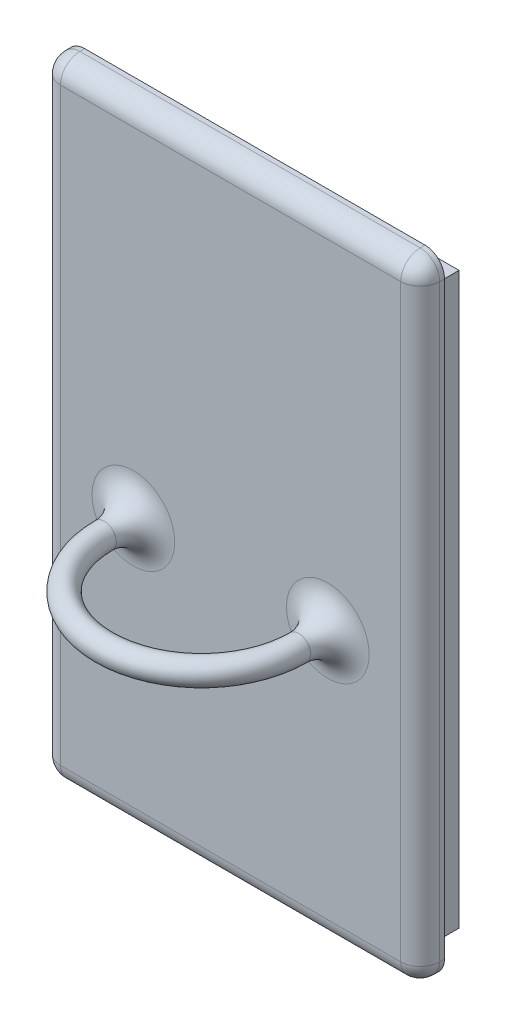
ISO-10303-21;
HEADER;
FILE_DESCRIPTION(('STEP AP214'),'2;1');
FILE_NAME('part.step','',(''),(''),'','','');
FILE_SCHEMA(('AUTOMOTIVE_DESIGN { 1 0 10303 214 1 1 1 1 }'));
ENDSEC;
DATA;
#1=APPLICATION_CONTEXT('core data for automotive mechanical design processes');
#2=APPLICATION_PROTOCOL_DEFINITION('international standard','automotive_design',2000,#1);
#3=PRODUCT_CONTEXT('',#1,'mechanical');
#4=PRODUCT('Part','Part','',(#3));
#5=PRODUCT_RELATED_PRODUCT_CATEGORY('part','',(#4));
#6=PRODUCT_DEFINITION_FORMATION('','',#4);
#7=PRODUCT_DEFINITION_CONTEXT('part definition',#1,'design');
#8=PRODUCT_DEFINITION('design','',#6,#7);
#9=PRODUCT_DEFINITION_SHAPE('','',#8);
#10=(LENGTH_UNIT() NAMED_UNIT(*) SI_UNIT(.MILLI.,.METRE.));
#11=(NAMED_UNIT(*) PLANE_ANGLE_UNIT() SI_UNIT($,.RADIAN.));
#12=(NAMED_UNIT(*) SI_UNIT($,.STERADIAN.) SOLID_ANGLE_UNIT());
#13=UNCERTAINTY_MEASURE_WITH_UNIT(LENGTH_MEASURE(1.E-05),#10,'distance_accuracy_value','');
#14=(GEOMETRIC_REPRESENTATION_CONTEXT(3) GLOBAL_UNCERTAINTY_ASSIGNED_CONTEXT((#13)) GLOBAL_UNIT_ASSIGNED_CONTEXT((#10,
#11,#12)) REPRESENTATION_CONTEXT('',''));
#15=CARTESIAN_POINT('',(0.,0.,0.));
#16=DIRECTION('',(0.,0.,1.));
#17=DIRECTION('',(1.,0.,0.));
#18=AXIS2_PLACEMENT_3D('',#15,#16,#17);
#19=CARTESIAN_POINT('',(0.,0.,0.));
#20=DIRECTION('',(0.,0.,-1.));
#21=DIRECTION('',(-1.,0.,0.));
#22=AXIS2_PLACEMENT_3D('',#19,#20,#21);
#23=PLANE('',#22);
#24=DIRECTION('',(-1.,0.,0.));
#25=VECTOR('',#24,1.);
#26=CARTESIAN_POINT('',(-24.765,41.021,0.));
#27=LINE('',#26,#25);
#28=CARTESIAN_POINT('',(22.225,41.021,0.));
#29=VERTEX_POINT('',#28);
#30=CARTESIAN_POINT('',(-22.225,41.021,0.));
#31=VERTEX_POINT('',#30);
#32=EDGE_CURVE('E250',#29,#31,#27,.T.);
#33=ORIENTED_EDGE('',*,*,#32,.F.);
#34=CARTESIAN_POINT('',(22.225,38.481,0.));
#35=DIRECTION('',(0.,0.,-1.));
#36=DIRECTION('',(-1.,0.,0.));
#37=AXIS2_PLACEMENT_3D('',#34,#35,#36);
#38=CIRCLE('',#37,2.54);
#39=CARTESIAN_POINT('',(24.765,38.481,0.));
#40=VERTEX_POINT('',#39);
#41=EDGE_CURVE('E315',#29,#40,#38,.T.);
#42=ORIENTED_EDGE('',*,*,#41,.T.);
#43=DIRECTION('',(0.,1.,0.));
#44=VECTOR('',#43,1.);
#45=CARTESIAN_POINT('',(24.765,-18.570359608,0.));
#46=LINE('',#45,#44);
#47=CARTESIAN_POINT('',(24.765,-38.481,0.));
#48=VERTEX_POINT('',#47);
#49=EDGE_CURVE('E266',#48,#40,#46,.T.);
#50=ORIENTED_EDGE('',*,*,#49,.F.);
#51=CARTESIAN_POINT('',(22.225,-38.481,0.));
#52=DIRECTION('',(0.,0.,-1.));
#53=DIRECTION('',(-1.,0.,0.));
#54=AXIS2_PLACEMENT_3D('',#51,#52,#53);
#55=CIRCLE('',#54,2.54);
#56=CARTESIAN_POINT('',(22.225,-41.021,0.));
#57=VERTEX_POINT('',#56);
#58=EDGE_CURVE('E309',#48,#57,#55,.T.);
#59=ORIENTED_EDGE('',*,*,#58,.T.);
#60=DIRECTION('',(1.,0.,0.));
#61=VECTOR('',#60,1.);
#62=CARTESIAN_POINT('',(-24.765,-41.021,0.));
#63=LINE('',#62,#61);
#64=CARTESIAN_POINT('',(-22.225,-41.021,0.));
#65=VERTEX_POINT('',#64);
#66=EDGE_CURVE('E253',#65,#57,#63,.T.);
#67=ORIENTED_EDGE('',*,*,#66,.F.);
#68=CARTESIAN_POINT('',(-22.225,-38.481,0.));
#69=DIRECTION('',(0.,0.,-1.));
#70=DIRECTION('',(-1.,0.,0.));
#71=AXIS2_PLACEMENT_3D('',#68,#69,#70);
#72=CIRCLE('',#71,2.54);
#73=CARTESIAN_POINT('',(-24.765,-38.481,0.));
#74=VERTEX_POINT('',#73);
#75=EDGE_CURVE('E311',#65,#74,#72,.T.);
#76=ORIENTED_EDGE('',*,*,#75,.T.);
#77=DIRECTION('',(0.,-1.,0.));
#78=VECTOR('',#77,1.);
#79=CARTESIAN_POINT('',(-24.765,-37.211,0.));
#80=LINE('',#79,#78);
#81=CARTESIAN_POINT('',(-24.765,38.481,0.));
#82=VERTEX_POINT('',#81);
#83=EDGE_CURVE('E263',#82,#74,#80,.T.);
#84=ORIENTED_EDGE('',*,*,#83,.F.);
#85=CARTESIAN_POINT('',(-22.225,38.481,0.));
#86=DIRECTION('',(0.,0.,-1.));
#87=DIRECTION('',(-1.,0.,0.));
#88=AXIS2_PLACEMENT_3D('',#85,#86,#87);
#89=CIRCLE('',#88,2.54);
#90=EDGE_CURVE('E313',#82,#31,#89,.T.);
#91=ORIENTED_EDGE('',*,*,#90,.T.);
#92=EDGE_LOOP('',(#33,#42,#50,#59,#67,#76,#84,#91));
#93=FACE_BOUND('',#92,.T.);
#94=DIRECTION('',(1.,0.,0.));
#95=VECTOR('',#94,1.);
#96=CARTESIAN_POINT('',(23.495,37.211,0.));
#97=LINE('',#96,#95);
#98=CARTESIAN_POINT('',(-23.495,37.211,0.));
#99=VERTEX_POINT('',#98);
#100=CARTESIAN_POINT('',(23.495,37.211,0.));
#101=VERTEX_POINT('',#100);
#102=EDGE_CURVE('E237',#99,#101,#97,.T.);
#103=ORIENTED_EDGE('',*,*,#102,.F.);
#104=DIRECTION('',(0.,1.,0.));
#105=VECTOR('',#104,1.);
#106=CARTESIAN_POINT('',(-23.495,-37.211,0.));
#107=LINE('',#106,#105);
#108=CARTESIAN_POINT('',(-23.495,-37.211,0.));
#109=VERTEX_POINT('',#108);
#110=EDGE_CURVE('E202',#109,#99,#107,.T.);
#111=ORIENTED_EDGE('',*,*,#110,.F.);
#112=DIRECTION('',(-1.,0.,0.));
#113=VECTOR('',#112,1.);
#114=CARTESIAN_POINT('',(23.495,-37.211,0.));
#115=LINE('',#114,#113);
#116=CARTESIAN_POINT('',(23.495,-37.211,0.));
#117=VERTEX_POINT('',#116);
#118=EDGE_CURVE('E228',#117,#109,#115,.T.);
#119=ORIENTED_EDGE('',*,*,#118,.F.);
#120=DIRECTION('',(0.,-1.,0.));
#121=VECTOR('',#120,1.);
#122=CARTESIAN_POINT('',(23.495,-37.211,0.));
#123=LINE('',#122,#121);
#124=EDGE_CURVE('E239',#101,#117,#123,.T.);
#125=ORIENTED_EDGE('',*,*,#124,.F.);
#126=EDGE_LOOP('',(#103,#111,#119,#125));
#127=FACE_BOUND('',#126,.T.);
#128=ADVANCED_FACE('F57',(#93,#127),#23,.T.);
#129=CARTESIAN_POINT('',(0.,0.,3.175));
#130=DIRECTION('',(0.,0.,-1.));
#131=DIRECTION('',(-1.,0.,0.));
#132=AXIS2_PLACEMENT_3D('',#129,#130,#131);
#133=PLANE('',#132);
#134=DIRECTION('',(0.,1.,0.));
#135=VECTOR('',#134,1.);
#136=CARTESIAN_POINT('',(22.225,0.,3.175));
#137=LINE('',#136,#135);
#138=CARTESIAN_POINT('',(22.225,-38.481,3.175));
#139=VERTEX_POINT('',#138);
#140=CARTESIAN_POINT('',(22.225,38.481,3.175));
#141=VERTEX_POINT('',#140);
#142=EDGE_CURVE('E281',#139,#141,#137,.T.);
#143=ORIENTED_EDGE('',*,*,#142,.T.);
#144=DIRECTION('',(-1.,0.,0.));
#145=VECTOR('',#144,1.);
#146=CARTESIAN_POINT('',(-24.765,38.481,3.175));
#147=LINE('',#146,#145);
#148=CARTESIAN_POINT('',(-22.225,38.481,3.175));
#149=VERTEX_POINT('',#148);
#150=EDGE_CURVE('E284',#141,#149,#147,.T.);
#151=ORIENTED_EDGE('',*,*,#150,.T.);
#152=DIRECTION('',(0.,-1.,0.));
#153=VECTOR('',#152,1.);
#154=CARTESIAN_POINT('',(-22.225,0.,3.175));
#155=LINE('',#154,#153);
#156=CARTESIAN_POINT('',(-22.225,-38.481,3.175));
#157=VERTEX_POINT('',#156);
#158=EDGE_CURVE('E278',#149,#157,#155,.T.);
#159=ORIENTED_EDGE('',*,*,#158,.T.);
#160=DIRECTION('',(1.,0.,0.));
#161=VECTOR('',#160,1.);
#162=CARTESIAN_POINT('',(24.765,-38.481,3.175));
#163=LINE('',#162,#161);
#164=EDGE_CURVE('E275',#157,#139,#163,.T.);
#165=ORIENTED_EDGE('',*,*,#164,.T.);
#166=EDGE_LOOP('',(#143,#151,#159,#165));
#167=FACE_BOUND('',#166,.T.);
#168=CARTESIAN_POINT('',(12.7,-5.77067984800001,3.175));
#169=DIRECTION('',(0.,0.,-1.));
#170=DIRECTION('',(-1.,0.,0.));
#171=AXIS2_PLACEMENT_3D('',#168,#169,#170);
#172=CIRCLE('',#171,5.3975);
#173=CARTESIAN_POINT('',(7.30249999999998,-5.77067984800001,3.175));
#174=VERTEX_POINT('',#173);
#175=EDGE_CURVE('E272',#174,#174,#172,.T.);
#176=ORIENTED_EDGE('',*,*,#175,.T.);
#177=EDGE_LOOP('',(#176));
#178=FACE_BOUND('',#177,.T.);
#179=CARTESIAN_POINT('',(-12.7,-5.77067984800001,3.175));
#180=DIRECTION('',(0.,0.,-1.));
#181=DIRECTION('',(-1.,0.,0.));
#182=AXIS2_PLACEMENT_3D('',#179,#180,#181);
#183=CIRCLE('',#182,5.3975);
#184=CARTESIAN_POINT('',(-18.0975,-5.77067984800001,3.175));
#185=VERTEX_POINT('',#184);
#186=EDGE_CURVE('E269',#185,#185,#183,.T.);
#187=ORIENTED_EDGE('',*,*,#186,.T.);
#188=EDGE_LOOP('',(#187));
#189=FACE_BOUND('',#188,.T.);
#190=ADVANCED_FACE('F381',(#167,#178,#189),#133,.F.);
#191=CARTESIAN_POINT('',(-24.765,-37.211,3.175));
#192=DIRECTION('',(1.,0.,0.));
#193=DIRECTION('',(0.,1.,0.));
#194=AXIS2_PLACEMENT_3D('',#191,#192,#193);
#195=PLANE('',#194);
#196=DIRECTION('',(0.,-1.,0.));
#197=VECTOR('',#196,1.);
#198=CARTESIAN_POINT('',(-24.765,-37.211,0.635));
#199=LINE('',#198,#197);
#200=CARTESIAN_POINT('',(-24.765,-38.481,0.635));
#201=VERTEX_POINT('',#200);
#202=CARTESIAN_POINT('',(-24.765,38.481,0.635));
#203=VERTEX_POINT('',#202);
#204=EDGE_CURVE('E290',#201,#203,#199,.F.);
#205=ORIENTED_EDGE('',*,*,#204,.T.);
#206=DIRECTION('',(0.,0.,1.));
#207=VECTOR('',#206,1.);
#208=CARTESIAN_POINT('',(-24.765,38.481,0.));
#209=LINE('',#208,#207);
#210=EDGE_CURVE('E320',#203,#82,#209,.F.);
#211=ORIENTED_EDGE('',*,*,#210,.T.);
#212=ORIENTED_EDGE('',*,*,#83,.T.);
#213=DIRECTION('',(0.,0.,1.));
#214=VECTOR('',#213,1.);
#215=CARTESIAN_POINT('',(-24.765,-38.481,0.634999999999997));
#216=LINE('',#215,#214);
#217=EDGE_CURVE('E317',#74,#201,#216,.T.);
#218=ORIENTED_EDGE('',*,*,#217,.T.);
#219=EDGE_LOOP('',(#205,#211,#212,#218));
#220=FACE_BOUND('',#219,.T.);
#221=ADVANCED_FACE('F393',(#220),#195,.F.);
#222=CARTESIAN_POINT('',(24.765,-18.570359608,3.175));
#223=DIRECTION('',(-1.,0.,0.));
#224=DIRECTION('',(0.,-1.,0.));
#225=AXIS2_PLACEMENT_3D('',#222,#223,#224);
#226=PLANE('',#225);
#227=ORIENTED_EDGE('',*,*,#49,.T.);
#228=DIRECTION('',(0.,0.,1.));
#229=VECTOR('',#228,1.);
#230=CARTESIAN_POINT('',(24.765,38.481,0.634999999999997));
#231=LINE('',#230,#229);
#232=CARTESIAN_POINT('',(24.765,38.481,0.635));
#233=VERTEX_POINT('',#232);
#234=EDGE_CURVE('E301',#40,#233,#231,.T.);
#235=ORIENTED_EDGE('',*,*,#234,.T.);
#236=DIRECTION('',(0.,1.,0.));
#237=VECTOR('',#236,1.);
#238=CARTESIAN_POINT('',(24.765,-18.570359608,0.635));
#239=LINE('',#238,#237);
#240=CARTESIAN_POINT('',(24.765,-38.481,0.635));
#241=VERTEX_POINT('',#240);
#242=EDGE_CURVE('E287',#233,#241,#239,.F.);
#243=ORIENTED_EDGE('',*,*,#242,.T.);
#244=DIRECTION('',(0.,0.,1.));
#245=VECTOR('',#244,1.);
#246=CARTESIAN_POINT('',(24.765,-38.481,0.));
#247=LINE('',#246,#245);
#248=EDGE_CURVE('E299',#241,#48,#247,.F.);
#249=ORIENTED_EDGE('',*,*,#248,.T.);
#250=EDGE_LOOP('',(#227,#235,#243,#249));
#251=FACE_BOUND('',#250,.T.);
#252=ADVANCED_FACE('F363',(#251),#226,.F.);
#253=CARTESIAN_POINT('',(0.,-5.77067984800001,6.985));
#254=DIRECTION('',(0.,-1.,0.));
#255=DIRECTION('',(0.,0.,-1.));
#256=AXIS2_PLACEMENT_3D('',#253,#254,#255);
#257=TOROIDAL_SURFACE('',#256,12.7,1.5875);
#258=CARTESIAN_POINT('',(12.7,-5.77067984800001,6.98499999999998));
#259=DIRECTION('',(0.,0.,1.));
#260=DIRECTION('',(1.,0.,0.));
#261=AXIS2_PLACEMENT_3D('',#258,#259,#260);
#262=CIRCLE('',#261,1.5875);
#263=CARTESIAN_POINT('',(14.2875,-5.77067984800001,6.98499999999997));
#264=VERTEX_POINT('',#263);
#265=EDGE_CURVE('E257',#264,#264,#262,.T.);
#266=CARTESIAN_POINT('',(-12.7,-5.77067984800001,6.985));
#267=DIRECTION('',(0.,0.,-1.));
#268=DIRECTION('',(-1.,0.,0.));
#269=AXIS2_PLACEMENT_3D('',#266,#267,#268);
#270=CIRCLE('',#269,1.5875);
#271=CARTESIAN_POINT('',(-14.2875,-5.77067984800001,6.985));
#272=VERTEX_POINT('',#271);
#273=EDGE_CURVE('E260',#272,#272,#270,.T.);
#274=CARTESIAN_POINT('',(0.,-5.77067984800001,6.985));
#275=DIRECTION('',(0.,-1.,0.));
#276=DIRECTION('',(0.,0.,-1.));
#277=AXIS2_PLACEMENT_3D('',#274,#275,#276);
#278=CIRCLE('',#277,14.2875);
#279=EDGE_CURVE('',#264,#272,#278,.T.);
#280=ORIENTED_EDGE('',*,*,#265,.T.);
#281=ORIENTED_EDGE('',*,*,#273,.F.);
#282=ORIENTED_EDGE('',*,*,#279,.T.);
#283=ORIENTED_EDGE('',*,*,#279,.F.);
#284=EDGE_LOOP('',(#280,#282,#281,#283));
#285=FACE_BOUND('',#284,.T.);
#286=ADVANCED_FACE('F651',(#285),#257,.T.);
#287=CARTESIAN_POINT('',(12.7,-5.77067984800001,6.985));
#288=DIRECTION('',(0.,0.,-1.));
#289=DIRECTION('',(-1.,0.,0.));
#290=AXIS2_PLACEMENT_3D('',#287,#288,#289);
#291=TOROIDAL_SURFACE('',#290,5.3975,3.81);
#292=ORIENTED_EDGE('',*,*,#175,.F.);
#293=EDGE_LOOP('',(#292));
#294=FACE_BOUND('',#293,.T.);
#295=ORIENTED_EDGE('',*,*,#265,.F.);
#296=EDGE_LOOP('',(#295));
#297=FACE_BOUND('',#296,.T.);
#298=ADVANCED_FACE('F424',(#294,#297),#291,.F.);
#299=CARTESIAN_POINT('',(-12.7,-5.77067984800001,6.985));
#300=DIRECTION('',(0.,0.,-1.));
#301=DIRECTION('',(-1.,0.,0.));
#302=AXIS2_PLACEMENT_3D('',#299,#300,#301);
#303=TOROIDAL_SURFACE('',#302,5.3975,3.81);
#304=ORIENTED_EDGE('',*,*,#273,.T.);
#305=EDGE_LOOP('',(#304));
#306=FACE_BOUND('',#305,.T.);
#307=ORIENTED_EDGE('',*,*,#186,.F.);
#308=EDGE_LOOP('',(#307));
#309=FACE_BOUND('',#308,.T.);
#310=ADVANCED_FACE('F415',(#306,#309),#303,.F.);
#311=CARTESIAN_POINT('',(-24.765,-41.021,-49.6763223276442));
#312=DIRECTION('',(0.,-1.,0.));
#313=DIRECTION('',(0.,0.,-1.));
#314=AXIS2_PLACEMENT_3D('',#311,#312,#313);
#315=PLANE('',#314);
#316=DIRECTION('',(1.,0.,0.));
#317=VECTOR('',#316,1.);
#318=CARTESIAN_POINT('',(-24.765,-41.021,0.635));
#319=LINE('',#318,#317);
#320=CARTESIAN_POINT('',(22.225,-41.021,0.635));
#321=VERTEX_POINT('',#320);
#322=CARTESIAN_POINT('',(-22.225,-41.021,0.635));
#323=VERTEX_POINT('',#322);
#324=EDGE_CURVE('E296',#321,#323,#319,.F.);
#325=ORIENTED_EDGE('',*,*,#324,.T.);
#326=DIRECTION('',(0.,0.,1.));
#327=VECTOR('',#326,1.);
#328=CARTESIAN_POINT('',(-22.225,-41.021,0.));
#329=LINE('',#328,#327);
#330=EDGE_CURVE('E324',#323,#65,#329,.F.);
#331=ORIENTED_EDGE('',*,*,#330,.T.);
#332=ORIENTED_EDGE('',*,*,#66,.T.);
#333=DIRECTION('',(0.,0.,1.));
#334=VECTOR('',#333,1.);
#335=CARTESIAN_POINT('',(22.225,-41.021,0.634999999999997));
#336=LINE('',#335,#334);
#337=EDGE_CURVE('E322',#57,#321,#336,.T.);
#338=ORIENTED_EDGE('',*,*,#337,.T.);
#339=EDGE_LOOP('',(#325,#331,#332,#338));
#340=FACE_BOUND('',#339,.T.);
#341=ADVANCED_FACE('F412',(#340),#315,.T.);
#342=CARTESIAN_POINT('',(-24.765,41.021,-49.6763223276442));
#343=DIRECTION('',(0.,1.,0.));
#344=DIRECTION('',(0.,0.,1.));
#345=AXIS2_PLACEMENT_3D('',#342,#343,#344);
#346=PLANE('',#345);
#347=DIRECTION('',(-1.,0.,0.));
#348=VECTOR('',#347,1.);
#349=CARTESIAN_POINT('',(24.765,41.021,0.635));
#350=LINE('',#349,#348);
#351=CARTESIAN_POINT('',(-22.225,41.021,0.635));
#352=VERTEX_POINT('',#351);
#353=CARTESIAN_POINT('',(22.225,41.021,0.635));
#354=VERTEX_POINT('',#353);
#355=EDGE_CURVE('E293',#352,#354,#350,.F.);
#356=ORIENTED_EDGE('',*,*,#355,.T.);
#357=DIRECTION('',(0.,0.,1.));
#358=VECTOR('',#357,1.);
#359=CARTESIAN_POINT('',(22.225,41.021,0.));
#360=LINE('',#359,#358);
#361=EDGE_CURVE('E307',#354,#29,#360,.F.);
#362=ORIENTED_EDGE('',*,*,#361,.T.);
#363=ORIENTED_EDGE('',*,*,#32,.T.);
#364=DIRECTION('',(0.,0.,1.));
#365=VECTOR('',#364,1.);
#366=CARTESIAN_POINT('',(-22.225,41.021,0.634999999999997));
#367=LINE('',#366,#365);
#368=EDGE_CURVE('E304',#31,#352,#367,.T.);
#369=ORIENTED_EDGE('',*,*,#368,.T.);
#370=EDGE_LOOP('',(#356,#362,#363,#369));
#371=FACE_BOUND('',#370,.T.);
#372=ADVANCED_FACE('F414',(#371),#346,.T.);
#373=CARTESIAN_POINT('',(-22.225,0.,0.635));
#374=DIRECTION('',(0.,-1.,0.));
#375=DIRECTION('',(1.,0.,0.));
#376=AXIS2_PLACEMENT_3D('',#373,#374,#375);
#377=CYLINDRICAL_SURFACE('',#376,2.54);
#378=ORIENTED_EDGE('',*,*,#158,.F.);
#379=CARTESIAN_POINT('',(-22.225,38.481,0.635));
#380=DIRECTION('',(0.,-1.,0.));
#381=DIRECTION('',(1.,0.,0.));
#382=AXIS2_PLACEMENT_3D('',#379,#380,#381);
#383=CIRCLE('',#382,2.54);
#384=EDGE_CURVE('E12',#149,#203,#383,.T.);
#385=ORIENTED_EDGE('',*,*,#384,.T.);
#386=ORIENTED_EDGE('',*,*,#204,.F.);
#387=CARTESIAN_POINT('',(-22.225,-38.481,0.635));
#388=DIRECTION('',(0.,-1.,0.));
#389=DIRECTION('',(1.,0.,0.));
#390=AXIS2_PLACEMENT_3D('',#387,#388,#389);
#391=CIRCLE('',#390,2.54);
#392=EDGE_CURVE('E66',#201,#157,#391,.F.);
#393=ORIENTED_EDGE('',*,*,#392,.T.);
#394=EDGE_LOOP('',(#378,#385,#386,#393));
#395=FACE_BOUND('',#394,.T.);
#396=ADVANCED_FACE('F397',(#395),#377,.T.);
#397=CARTESIAN_POINT('',(0.,-38.481,0.635));
#398=DIRECTION('',(-1.,0.,0.));
#399=DIRECTION('',(0.,0.,1.));
#400=AXIS2_PLACEMENT_3D('',#397,#398,#399);
#401=CYLINDRICAL_SURFACE('',#400,2.54);
#402=ORIENTED_EDGE('',*,*,#324,.F.);
#403=CARTESIAN_POINT('',(22.225,-38.481,0.635));
#404=DIRECTION('',(-1.,0.,0.));
#405=DIRECTION('',(0.,0.,1.));
#406=AXIS2_PLACEMENT_3D('',#403,#404,#405);
#407=CIRCLE('',#406,2.54);
#408=EDGE_CURVE('E333',#321,#139,#407,.T.);
#409=ORIENTED_EDGE('',*,*,#408,.T.);
#410=ORIENTED_EDGE('',*,*,#164,.F.);
#411=CARTESIAN_POINT('',(-22.225,-38.481,0.635));
#412=DIRECTION('',(-1.,0.,0.));
#413=DIRECTION('',(0.,0.,1.));
#414=AXIS2_PLACEMENT_3D('',#411,#412,#413);
#415=CIRCLE('',#414,2.54);
#416=EDGE_CURVE('E331',#157,#323,#415,.F.);
#417=ORIENTED_EDGE('',*,*,#416,.T.);
#418=EDGE_LOOP('',(#402,#409,#410,#417));
#419=FACE_BOUND('',#418,.T.);
#420=ADVANCED_FACE('F387',(#419),#401,.T.);
#421=CARTESIAN_POINT('',(0.,38.481,0.635));
#422=DIRECTION('',(1.,0.,0.));
#423=DIRECTION('',(0.,0.,-1.));
#424=AXIS2_PLACEMENT_3D('',#421,#422,#423);
#425=CYLINDRICAL_SURFACE('',#424,2.54);
#426=ORIENTED_EDGE('',*,*,#150,.F.);
#427=CARTESIAN_POINT('',(22.225,38.481,0.635));
#428=DIRECTION('',(1.,0.,0.));
#429=DIRECTION('',(0.,0.,-1.));
#430=AXIS2_PLACEMENT_3D('',#427,#428,#429);
#431=CIRCLE('',#430,2.54);
#432=EDGE_CURVE('E337',#141,#354,#431,.F.);
#433=ORIENTED_EDGE('',*,*,#432,.T.);
#434=ORIENTED_EDGE('',*,*,#355,.F.);
#435=CARTESIAN_POINT('',(-22.225,38.481,0.635));
#436=DIRECTION('',(1.,0.,0.));
#437=DIRECTION('',(0.,0.,-1.));
#438=AXIS2_PLACEMENT_3D('',#435,#436,#437);
#439=CIRCLE('',#438,2.54);
#440=EDGE_CURVE('E335',#352,#149,#439,.T.);
#441=ORIENTED_EDGE('',*,*,#440,.T.);
#442=EDGE_LOOP('',(#426,#433,#434,#441));
#443=FACE_BOUND('',#442,.T.);
#444=ADVANCED_FACE('F376',(#443),#425,.T.);
#445=CARTESIAN_POINT('',(22.225,0.,0.635));
#446=DIRECTION('',(0.,1.,0.));
#447=DIRECTION('',(-1.,0.,0.));
#448=AXIS2_PLACEMENT_3D('',#445,#446,#447);
#449=CYLINDRICAL_SURFACE('',#448,2.54);
#450=ORIENTED_EDGE('',*,*,#142,.F.);
#451=CARTESIAN_POINT('',(22.225,-38.481,0.635));
#452=DIRECTION('',(0.,1.,0.));
#453=DIRECTION('',(-1.,0.,0.));
#454=AXIS2_PLACEMENT_3D('',#451,#452,#453);
#455=CIRCLE('',#454,2.54);
#456=EDGE_CURVE('E328',#139,#241,#455,.T.);
#457=ORIENTED_EDGE('',*,*,#456,.T.);
#458=ORIENTED_EDGE('',*,*,#242,.F.);
#459=CARTESIAN_POINT('',(22.225,38.481,0.635));
#460=DIRECTION('',(0.,1.,0.));
#461=DIRECTION('',(-1.,0.,0.));
#462=AXIS2_PLACEMENT_3D('',#459,#460,#461);
#463=CIRCLE('',#462,2.54);
#464=EDGE_CURVE('E326',#233,#141,#463,.F.);
#465=ORIENTED_EDGE('',*,*,#464,.T.);
#466=EDGE_LOOP('',(#450,#457,#458,#465));
#467=FACE_BOUND('',#466,.T.);
#468=ADVANCED_FACE('F362',(#467),#449,.T.);
#469=CARTESIAN_POINT('',(22.225,38.481,0.635));
#470=DIRECTION('',(0.,0.,1.));
#471=DIRECTION('',(1.,0.,0.));
#472=AXIS2_PLACEMENT_3D('',#469,#470,#471);
#473=SPHERICAL_SURFACE('',#472,2.54);
#474=ORIENTED_EDGE('',*,*,#432,.F.);
#475=ORIENTED_EDGE('',*,*,#464,.F.);
#476=CARTESIAN_POINT('',(22.225,38.481,0.635));
#477=DIRECTION('',(0.,0.,-1.));
#478=DIRECTION('',(-1.,0.,0.));
#479=AXIS2_PLACEMENT_3D('',#476,#477,#478);
#480=CIRCLE('',#479,2.54);
#481=EDGE_CURVE('E254',#354,#233,#480,.T.);
#482=ORIENTED_EDGE('',*,*,#481,.F.);
#483=EDGE_LOOP('',(#474,#475,#482));
#484=FACE_BOUND('',#483,.T.);
#485=ADVANCED_FACE('F373',(#484),#473,.T.);
#486=CARTESIAN_POINT('',(22.225,38.481,3.175));
#487=DIRECTION('',(0.,0.,-1.));
#488=DIRECTION('',(-1.,0.,0.));
#489=AXIS2_PLACEMENT_3D('',#486,#487,#488);
#490=CYLINDRICAL_SURFACE('',#489,2.54);
#491=ORIENTED_EDGE('',*,*,#41,.F.);
#492=ORIENTED_EDGE('',*,*,#361,.F.);
#493=ORIENTED_EDGE('',*,*,#481,.T.);
#494=ORIENTED_EDGE('',*,*,#234,.F.);
#495=EDGE_LOOP('',(#491,#492,#493,#494));
#496=FACE_BOUND('',#495,.T.);
#497=ADVANCED_FACE('F367',(#496),#490,.T.);
#498=CARTESIAN_POINT('',(-22.225,38.481,0.635));
#499=DIRECTION('',(0.,0.,1.));
#500=DIRECTION('',(1.,0.,0.));
#501=AXIS2_PLACEMENT_3D('',#498,#499,#500);
#502=SPHERICAL_SURFACE('',#501,2.54);
#503=ORIENTED_EDGE('',*,*,#384,.F.);
#504=ORIENTED_EDGE('',*,*,#440,.F.);
#505=CARTESIAN_POINT('',(-22.225,38.481,0.635));
#506=DIRECTION('',(0.,0.,-1.));
#507=DIRECTION('',(-1.,0.,0.));
#508=AXIS2_PLACEMENT_3D('',#505,#506,#507);
#509=CIRCLE('',#508,2.54);
#510=EDGE_CURVE('E341',#203,#352,#509,.T.);
#511=ORIENTED_EDGE('',*,*,#510,.F.);
#512=EDGE_LOOP('',(#503,#504,#511));
#513=FACE_BOUND('',#512,.T.);
#514=ADVANCED_FACE('F401',(#513),#502,.T.);
#515=CARTESIAN_POINT('',(-22.225,38.481,-49.6763223276442));
#516=DIRECTION('',(0.,0.,-1.));
#517=DIRECTION('',(-1.,0.,0.));
#518=AXIS2_PLACEMENT_3D('',#515,#516,#517);
#519=CYLINDRICAL_SURFACE('',#518,2.54);
#520=ORIENTED_EDGE('',*,*,#90,.F.);
#521=ORIENTED_EDGE('',*,*,#210,.F.);
#522=ORIENTED_EDGE('',*,*,#510,.T.);
#523=ORIENTED_EDGE('',*,*,#368,.F.);
#524=EDGE_LOOP('',(#520,#521,#522,#523));
#525=FACE_BOUND('',#524,.T.);
#526=ADVANCED_FACE('F405',(#525),#519,.T.);
#527=CARTESIAN_POINT('',(-22.225,-38.481,0.635));
#528=DIRECTION('',(0.,0.,1.));
#529=DIRECTION('',(1.,0.,0.));
#530=AXIS2_PLACEMENT_3D('',#527,#528,#529);
#531=SPHERICAL_SURFACE('',#530,2.54);
#532=ORIENTED_EDGE('',*,*,#416,.F.);
#533=ORIENTED_EDGE('',*,*,#392,.F.);
#534=CARTESIAN_POINT('',(-22.225,-38.481,0.635));
#535=DIRECTION('',(0.,0.,-1.));
#536=DIRECTION('',(-1.,0.,0.));
#537=AXIS2_PLACEMENT_3D('',#534,#535,#536);
#538=CIRCLE('',#537,2.54);
#539=EDGE_CURVE('E342',#323,#201,#538,.T.);
#540=ORIENTED_EDGE('',*,*,#539,.F.);
#541=EDGE_LOOP('',(#532,#533,#540));
#542=FACE_BOUND('',#541,.T.);
#543=ADVANCED_FACE('F389',(#542),#531,.T.);
#544=CARTESIAN_POINT('',(-22.225,-38.481,3.175));
#545=DIRECTION('',(0.,0.,-1.));
#546=DIRECTION('',(-1.,0.,0.));
#547=AXIS2_PLACEMENT_3D('',#544,#545,#546);
#548=CYLINDRICAL_SURFACE('',#547,2.54);
#549=ORIENTED_EDGE('',*,*,#75,.F.);
#550=ORIENTED_EDGE('',*,*,#330,.F.);
#551=ORIENTED_EDGE('',*,*,#539,.T.);
#552=ORIENTED_EDGE('',*,*,#217,.F.);
#553=EDGE_LOOP('',(#549,#550,#551,#552));
#554=FACE_BOUND('',#553,.T.);
#555=ADVANCED_FACE('F410',(#554),#548,.T.);
#556=CARTESIAN_POINT('',(22.225,-38.481,-49.6763223276442));
#557=DIRECTION('',(0.,0.,-1.));
#558=DIRECTION('',(-1.,0.,0.));
#559=AXIS2_PLACEMENT_3D('',#556,#557,#558);
#560=CYLINDRICAL_SURFACE('',#559,2.54);
#561=ORIENTED_EDGE('',*,*,#58,.F.);
#562=ORIENTED_EDGE('',*,*,#248,.F.);
#563=CARTESIAN_POINT('',(22.225,-38.481,0.635));
#564=DIRECTION('',(0.,0.,1.));
#565=DIRECTION('',(1.,0.,0.));
#566=AXIS2_PLACEMENT_3D('',#563,#564,#565);
#567=CIRCLE('',#566,2.54);
#568=EDGE_CURVE('E61',#321,#241,#567,.T.);
#569=ORIENTED_EDGE('',*,*,#568,.F.);
#570=ORIENTED_EDGE('',*,*,#337,.F.);
#571=EDGE_LOOP('',(#561,#562,#569,#570));
#572=FACE_BOUND('',#571,.T.);
#573=ADVANCED_FACE('F59',(#572),#560,.T.);
#574=CARTESIAN_POINT('',(22.225,-38.481,0.635));
#575=DIRECTION('',(0.,0.,1.));
#576=DIRECTION('',(1.,0.,0.));
#577=AXIS2_PLACEMENT_3D('',#574,#575,#576);
#578=SPHERICAL_SURFACE('',#577,2.54);
#579=ORIENTED_EDGE('',*,*,#456,.F.);
#580=ORIENTED_EDGE('',*,*,#408,.F.);
#581=ORIENTED_EDGE('',*,*,#568,.T.);
#582=EDGE_LOOP('',(#579,#580,#581));
#583=FACE_BOUND('',#582,.T.);
#584=ADVANCED_FACE('F353',(#583),#578,.T.);
#585=CARTESIAN_POINT('',(0.,0.,-3.175));
#586=DIRECTION('',(0.,0.,1.));
#587=DIRECTION('',(1.,0.,0.));
#588=AXIS2_PLACEMENT_3D('',#585,#586,#587);
#589=PLANE('',#588);
#590=DIRECTION('',(0.,1.,0.));
#591=VECTOR('',#590,1.);
#592=CARTESIAN_POINT('',(-23.495,-37.211,-3.175));
#593=LINE('',#592,#591);
#594=CARTESIAN_POINT('',(-23.495,-37.211,-3.175));
#595=VERTEX_POINT('',#594);
#596=CARTESIAN_POINT('',(-23.495,37.211,-3.175));
#597=VERTEX_POINT('',#596);
#598=EDGE_CURVE('E224',#595,#597,#593,.T.);
#599=ORIENTED_EDGE('',*,*,#598,.T.);
#600=DIRECTION('',(1.,0.,0.));
#601=VECTOR('',#600,1.);
#602=CARTESIAN_POINT('',(23.495,37.211,-3.175));
#603=LINE('',#602,#601);
#604=CARTESIAN_POINT('',(23.495,37.211,-3.175));
#605=VERTEX_POINT('',#604);
#606=EDGE_CURVE('E227',#597,#605,#603,.T.);
#607=ORIENTED_EDGE('',*,*,#606,.T.);
#608=DIRECTION('',(0.,-1.,0.));
#609=VECTOR('',#608,1.);
#610=CARTESIAN_POINT('',(23.495,-37.211,-3.175));
#611=LINE('',#610,#609);
#612=CARTESIAN_POINT('',(23.495,-37.211,-3.175));
#613=VERTEX_POINT('',#612);
#614=EDGE_CURVE('E230',#605,#613,#611,.T.);
#615=ORIENTED_EDGE('',*,*,#614,.T.);
#616=DIRECTION('',(-1.,0.,0.));
#617=VECTOR('',#616,1.);
#618=CARTESIAN_POINT('',(23.495,-37.211,-3.175));
#619=LINE('',#618,#617);
#620=EDGE_CURVE('E232',#613,#595,#619,.T.);
#621=ORIENTED_EDGE('',*,*,#620,.T.);
#622=EDGE_LOOP('',(#599,#607,#615,#621));
#623=FACE_BOUND('',#622,.T.);
#624=DIRECTION('',(-1.,0.,0.));
#625=VECTOR('',#624,1.);
#626=CARTESIAN_POINT('',(20.32,-34.036,-3.175));
#627=LINE('',#626,#625);
#628=CARTESIAN_POINT('',(20.32,-34.036,-3.175));
#629=VERTEX_POINT('',#628);
#630=CARTESIAN_POINT('',(-20.32,-34.036,-3.175));
#631=VERTEX_POINT('',#630);
#632=EDGE_CURVE('E185',#629,#631,#627,.T.);
#633=ORIENTED_EDGE('',*,*,#632,.F.);
#634=DIRECTION('',(0.,-1.,0.));
#635=VECTOR('',#634,1.);
#636=CARTESIAN_POINT('',(20.32,-34.036,-3.175));
#637=LINE('',#636,#635);
#638=CARTESIAN_POINT('',(20.32,34.036,-3.175));
#639=VERTEX_POINT('',#638);
#640=EDGE_CURVE('E210',#639,#629,#637,.T.);
#641=ORIENTED_EDGE('',*,*,#640,.F.);
#642=DIRECTION('',(1.,0.,0.));
#643=VECTOR('',#642,1.);
#644=CARTESIAN_POINT('',(20.32,34.036,-3.175));
#645=LINE('',#644,#643);
#646=CARTESIAN_POINT('',(-20.32,34.036,-3.175));
#647=VERTEX_POINT('',#646);
#648=EDGE_CURVE('E208',#647,#639,#645,.T.);
#649=ORIENTED_EDGE('',*,*,#648,.F.);
#650=DIRECTION('',(0.,1.,0.));
#651=VECTOR('',#650,1.);
#652=CARTESIAN_POINT('',(-20.32,-34.036,-3.175));
#653=LINE('',#652,#651);
#654=EDGE_CURVE('E194',#631,#647,#653,.T.);
#655=ORIENTED_EDGE('',*,*,#654,.F.);
#656=EDGE_LOOP('',(#633,#641,#649,#655));
#657=FACE_BOUND('',#656,.T.);
#658=ADVANCED_FACE('F206',(#623,#657),#589,.F.);
#659=CARTESIAN_POINT('',(-23.495,-37.211,-3.175));
#660=DIRECTION('',(1.,0.,0.));
#661=DIRECTION('',(0.,0.,-1.));
#662=AXIS2_PLACEMENT_3D('',#659,#660,#661);
#663=PLANE('',#662);
#664=ORIENTED_EDGE('',*,*,#110,.T.);
#665=DIRECTION('',(0.,0.,1.));
#666=VECTOR('',#665,1.);
#667=CARTESIAN_POINT('',(-23.495,37.211,-3.175));
#668=LINE('',#667,#666);
#669=EDGE_CURVE('E248',#597,#99,#668,.T.);
#670=ORIENTED_EDGE('',*,*,#669,.F.);
#671=ORIENTED_EDGE('',*,*,#598,.F.);
#672=DIRECTION('',(0.,0.,1.));
#673=VECTOR('',#672,1.);
#674=CARTESIAN_POINT('',(-23.495,-37.211,-3.175));
#675=LINE('',#674,#673);
#676=EDGE_CURVE('E234',#595,#109,#675,.T.);
#677=ORIENTED_EDGE('',*,*,#676,.T.);
#678=EDGE_LOOP('',(#664,#670,#671,#677));
#679=FACE_BOUND('',#678,.T.);
#680=ADVANCED_FACE('F459',(#679),#663,.F.);
#681=CARTESIAN_POINT('',(23.495,37.211,-3.175));
#682=DIRECTION('',(0.,-1.,0.));
#683=DIRECTION('',(0.,0.,-1.));
#684=AXIS2_PLACEMENT_3D('',#681,#682,#683);
#685=PLANE('',#684);
#686=ORIENTED_EDGE('',*,*,#102,.T.);
#687=DIRECTION('',(0.,0.,1.));
#688=VECTOR('',#687,1.);
#689=CARTESIAN_POINT('',(23.495,37.211,-3.175));
#690=LINE('',#689,#688);
#691=EDGE_CURVE('E245',#605,#101,#690,.T.);
#692=ORIENTED_EDGE('',*,*,#691,.F.);
#693=ORIENTED_EDGE('',*,*,#606,.F.);
#694=ORIENTED_EDGE('',*,*,#669,.T.);
#695=EDGE_LOOP('',(#686,#692,#693,#694));
#696=FACE_BOUND('',#695,.T.);
#697=ADVANCED_FACE('F466',(#696),#685,.F.);
#698=CARTESIAN_POINT('',(23.495,-37.211,-3.175));
#699=DIRECTION('',(-1.,0.,0.));
#700=DIRECTION('',(0.,0.,1.));
#701=AXIS2_PLACEMENT_3D('',#698,#699,#700);
#702=PLANE('',#701);
#703=ORIENTED_EDGE('',*,*,#124,.T.);
#704=DIRECTION('',(0.,0.,1.));
#705=VECTOR('',#704,1.);
#706=CARTESIAN_POINT('',(23.495,-37.211,-3.175));
#707=LINE('',#706,#705);
#708=EDGE_CURVE('E74',#613,#117,#707,.T.);
#709=ORIENTED_EDGE('',*,*,#708,.F.);
#710=ORIENTED_EDGE('',*,*,#614,.F.);
#711=ORIENTED_EDGE('',*,*,#691,.T.);
#712=EDGE_LOOP('',(#703,#709,#710,#711));
#713=FACE_BOUND('',#712,.T.);
#714=ADVANCED_FACE('F463',(#713),#702,.F.);
#715=CARTESIAN_POINT('',(23.495,-37.211,-3.175));
#716=DIRECTION('',(0.,1.,0.));
#717=DIRECTION('',(0.,0.,1.));
#718=AXIS2_PLACEMENT_3D('',#715,#716,#717);
#719=PLANE('',#718);
#720=ORIENTED_EDGE('',*,*,#118,.T.);
#721=ORIENTED_EDGE('',*,*,#676,.F.);
#722=ORIENTED_EDGE('',*,*,#620,.F.);
#723=ORIENTED_EDGE('',*,*,#708,.T.);
#724=EDGE_LOOP('',(#720,#721,#722,#723));
#725=FACE_BOUND('',#724,.T.);
#726=ADVANCED_FACE('F457',(#725),#719,.F.);
#727=CARTESIAN_POINT('',(20.32,-34.036,-3.175));
#728=DIRECTION('',(0.,1.,0.));
#729=DIRECTION('',(0.,0.,1.));
#730=AXIS2_PLACEMENT_3D('',#727,#728,#729);
#731=PLANE('',#730);
#732=DIRECTION('',(-1.,0.,0.));
#733=VECTOR('',#732,1.);
#734=CARTESIAN_POINT('',(20.32,-34.036,0.));
#735=LINE('',#734,#733);
#736=CARTESIAN_POINT('',(20.32,-34.036,0.));
#737=VERTEX_POINT('',#736);
#738=CARTESIAN_POINT('',(-20.32,-34.036,0.));
#739=VERTEX_POINT('',#738);
#740=EDGE_CURVE('E82',#737,#739,#735,.T.);
#741=ORIENTED_EDGE('',*,*,#740,.F.);
#742=DIRECTION('',(0.,0.,1.));
#743=VECTOR('',#742,1.);
#744=CARTESIAN_POINT('',(20.32,-34.036,-3.175));
#745=LINE('',#744,#743);
#746=EDGE_CURVE('E190',#629,#737,#745,.T.);
#747=ORIENTED_EDGE('',*,*,#746,.F.);
#748=ORIENTED_EDGE('',*,*,#632,.T.);
#749=DIRECTION('',(0.,0.,1.));
#750=VECTOR('',#749,1.);
#751=CARTESIAN_POINT('',(-20.32,-34.036,-3.175));
#752=LINE('',#751,#750);
#753=EDGE_CURVE('E188',#631,#739,#752,.T.);
#754=ORIENTED_EDGE('',*,*,#753,.T.);
#755=EDGE_LOOP('',(#741,#747,#748,#754));
#756=FACE_BOUND('',#755,.T.);
#757=ADVANCED_FACE('F187',(#756),#731,.T.);
#758=CARTESIAN_POINT('',(-20.32,-34.036,-3.175));
#759=DIRECTION('',(1.,0.,0.));
#760=DIRECTION('',(0.,1.,0.));
#761=AXIS2_PLACEMENT_3D('',#758,#759,#760);
#762=PLANE('',#761);
#763=DIRECTION('',(0.,1.,0.));
#764=VECTOR('',#763,1.);
#765=CARTESIAN_POINT('',(-20.32,-34.036,0.));
#766=LINE('',#765,#764);
#767=CARTESIAN_POINT('',(-20.32,34.036,0.));
#768=VERTEX_POINT('',#767);
#769=EDGE_CURVE('E201',#739,#768,#766,.T.);
#770=ORIENTED_EDGE('',*,*,#769,.F.);
#771=ORIENTED_EDGE('',*,*,#753,.F.);
#772=ORIENTED_EDGE('',*,*,#654,.T.);
#773=DIRECTION('',(0.,0.,1.));
#774=VECTOR('',#773,1.);
#775=CARTESIAN_POINT('',(-20.32,34.036,-3.175));
#776=LINE('',#775,#774);
#777=EDGE_CURVE('E203',#647,#768,#776,.T.);
#778=ORIENTED_EDGE('',*,*,#777,.T.);
#779=EDGE_LOOP('',(#770,#771,#772,#778));
#780=FACE_BOUND('',#779,.T.);
#781=ADVANCED_FACE('F198',(#780),#762,.T.);
#782=CARTESIAN_POINT('',(20.32,34.036,-3.175));
#783=DIRECTION('',(0.,-1.,0.));
#784=DIRECTION('',(0.,0.,-1.));
#785=AXIS2_PLACEMENT_3D('',#782,#783,#784);
#786=PLANE('',#785);
#787=DIRECTION('',(1.,0.,0.));
#788=VECTOR('',#787,1.);
#789=CARTESIAN_POINT('',(20.32,34.036,0.));
#790=LINE('',#789,#788);
#791=CARTESIAN_POINT('',(20.32,34.036,0.));
#792=VERTEX_POINT('',#791);
#793=EDGE_CURVE('E216',#768,#792,#790,.T.);
#794=ORIENTED_EDGE('',*,*,#793,.F.);
#795=ORIENTED_EDGE('',*,*,#777,.F.);
#796=ORIENTED_EDGE('',*,*,#648,.T.);
#797=DIRECTION('',(0.,0.,1.));
#798=VECTOR('',#797,1.);
#799=CARTESIAN_POINT('',(20.32,34.036,-3.175));
#800=LINE('',#799,#798);
#801=EDGE_CURVE('E220',#639,#792,#800,.T.);
#802=ORIENTED_EDGE('',*,*,#801,.T.);
#803=EDGE_LOOP('',(#794,#795,#796,#802));
#804=FACE_BOUND('',#803,.T.);
#805=ADVANCED_FACE('F443',(#804),#786,.T.);
#806=CARTESIAN_POINT('',(20.32,-34.036,-3.175));
#807=DIRECTION('',(-1.,0.,0.));
#808=DIRECTION('',(0.,0.,1.));
#809=AXIS2_PLACEMENT_3D('',#806,#807,#808);
#810=PLANE('',#809);
#811=DIRECTION('',(0.,-1.,0.));
#812=VECTOR('',#811,1.);
#813=CARTESIAN_POINT('',(20.32,-34.036,0.));
#814=LINE('',#813,#812);
#815=EDGE_CURVE('E195',#792,#737,#814,.T.);
#816=ORIENTED_EDGE('',*,*,#815,.F.);
#817=ORIENTED_EDGE('',*,*,#801,.F.);
#818=ORIENTED_EDGE('',*,*,#640,.T.);
#819=ORIENTED_EDGE('',*,*,#746,.T.);
#820=EDGE_LOOP('',(#816,#817,#818,#819));
#821=FACE_BOUND('',#820,.T.);
#822=ADVANCED_FACE('F439',(#821),#810,.T.);
#823=ORIENTED_EDGE('',*,*,#740,.T.);
#824=ORIENTED_EDGE('',*,*,#769,.T.);
#825=ORIENTED_EDGE('',*,*,#793,.T.);
#826=ORIENTED_EDGE('',*,*,#815,.T.);
#827=EDGE_LOOP('',(#823,#824,#825,#826));
#828=FACE_BOUND('',#827,.T.);
#829=ADVANCED_FACE('F430',(#828),#23,.T.);
#830=CLOSED_SHELL('',(#128,#190,#221,#252,#286,#298,#310,#341,#372,#396,#420,#444,#468,#485,
#497,#514,#526,#543,#555,#573,#584,#658,#680,#697,#714,#726,#757,#781,#805,#822,#829));
#831=MANIFOLD_SOLID_BREP('B2',#830);
#832=ADVANCED_BREP_SHAPE_REPRESENTATION('',(#18,#831),#14);
#833=SHAPE_DEFINITION_REPRESENTATION(#9,#832);
ENDSEC;
END-ISO-10303-21;
